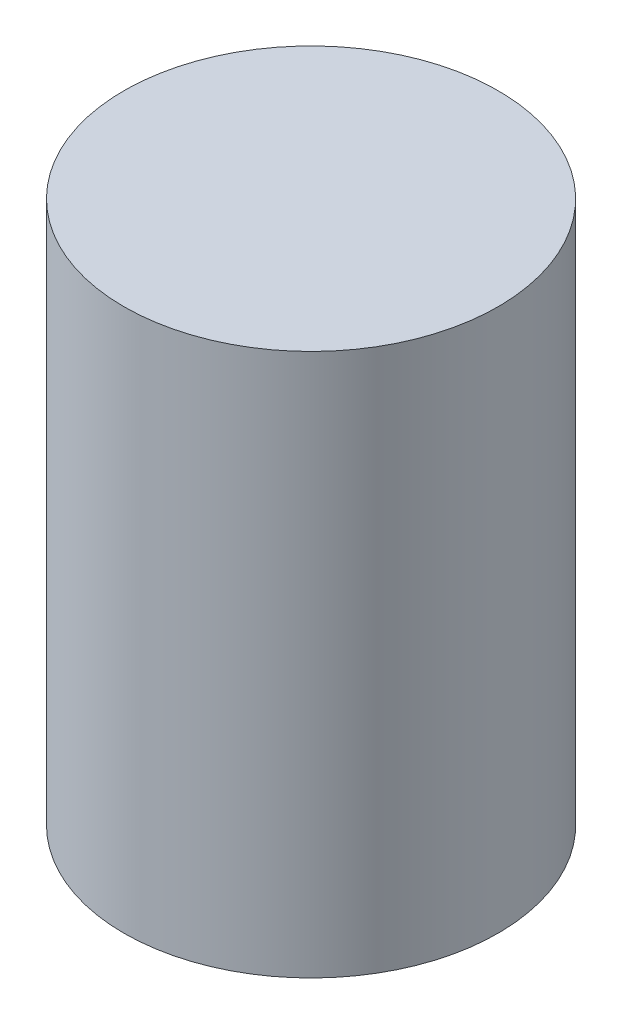
ISO-10303-21;
HEADER;
FILE_DESCRIPTION(('STEP AP214'),'2;1');
FILE_NAME('part.step','',(''),(''),'','','');
FILE_SCHEMA(('AUTOMOTIVE_DESIGN { 1 0 10303 214 1 1 1 1 }'));
ENDSEC;
DATA;
#1=APPLICATION_CONTEXT('core data for automotive mechanical design processes');
#2=APPLICATION_PROTOCOL_DEFINITION('international standard','automotive_design',2000,#1);
#3=PRODUCT_CONTEXT('',#1,'mechanical');
#4=PRODUCT('Part','Part','',(#3));
#5=PRODUCT_RELATED_PRODUCT_CATEGORY('part','',(#4));
#6=PRODUCT_DEFINITION_FORMATION('','',#4);
#7=PRODUCT_DEFINITION_CONTEXT('part definition',#1,'design');
#8=PRODUCT_DEFINITION('design','',#6,#7);
#9=PRODUCT_DEFINITION_SHAPE('','',#8);
#10=(LENGTH_UNIT() NAMED_UNIT(*) SI_UNIT(.MILLI.,.METRE.));
#11=(NAMED_UNIT(*) PLANE_ANGLE_UNIT() SI_UNIT($,.RADIAN.));
#12=(NAMED_UNIT(*) SI_UNIT($,.STERADIAN.) SOLID_ANGLE_UNIT());
#13=UNCERTAINTY_MEASURE_WITH_UNIT(LENGTH_MEASURE(1.E-05),#10,'distance_accuracy_value','');
#14=(GEOMETRIC_REPRESENTATION_CONTEXT(3) GLOBAL_UNCERTAINTY_ASSIGNED_CONTEXT((#13)) GLOBAL_UNIT_ASSIGNED_CONTEXT((#10,
#11,#12)) REPRESENTATION_CONTEXT('',''));
#15=CARTESIAN_POINT('',(0.,0.,0.));
#16=DIRECTION('',(0.,0.,1.));
#17=DIRECTION('',(1.,0.,0.));
#18=AXIS2_PLACEMENT_3D('',#15,#16,#17);
#19=CARTESIAN_POINT('',(0.,2.9,0.));
#20=DIRECTION('',(0.,-1.,0.));
#21=DIRECTION('',(0.,0.,-1.));
#22=AXIS2_PLACEMENT_3D('',#19,#20,#21);
#23=CYLINDRICAL_SURFACE('',#22,1.);
#24=CARTESIAN_POINT('',(0.,2.9,0.));
#25=DIRECTION('',(0.,1.,0.));
#26=DIRECTION('',(0.,0.,1.));
#27=AXIS2_PLACEMENT_3D('',#24,#25,#26);
#28=CIRCLE('',#27,1.);
#29=CARTESIAN_POINT('',(0.,2.9,1.));
#30=VERTEX_POINT('',#29);
#31=EDGE_CURVE('E10',#30,#30,#28,.T.);
#32=ORIENTED_EDGE('',*,*,#31,.F.);
#33=EDGE_LOOP('',(#32));
#34=FACE_BOUND('',#33,.T.);
#35=CARTESIAN_POINT('',(0.,0.,0.));
#36=DIRECTION('',(0.,1.,0.));
#37=DIRECTION('',(0.,0.,1.));
#38=AXIS2_PLACEMENT_3D('',#35,#36,#37);
#39=CIRCLE('',#38,1.);
#40=CARTESIAN_POINT('',(0.,0.,1.));
#41=VERTEX_POINT('',#40);
#42=EDGE_CURVE('E40',#41,#41,#39,.T.);
#43=ORIENTED_EDGE('',*,*,#42,.T.);
#44=EDGE_LOOP('',(#43));
#45=FACE_BOUND('',#44,.T.);
#46=ADVANCED_FACE('F37',(#34,#45),#23,.T.);
#47=CARTESIAN_POINT('',(0.,2.9,0.));
#48=DIRECTION('',(0.,1.,0.));
#49=DIRECTION('',(0.,0.,1.));
#50=AXIS2_PLACEMENT_3D('',#47,#48,#49);
#51=PLANE('',#50);
#52=ORIENTED_EDGE('',*,*,#31,.T.);
#53=EDGE_LOOP('',(#52));
#54=FACE_BOUND('',#53,.T.);
#55=ADVANCED_FACE('F54',(#54),#51,.T.);
#56=CARTESIAN_POINT('',(0.,0.,0.));
#57=DIRECTION('',(0.,1.,0.));
#58=DIRECTION('',(0.,0.,1.));
#59=AXIS2_PLACEMENT_3D('',#56,#57,#58);
#60=PLANE('',#59);
#61=ORIENTED_EDGE('',*,*,#42,.F.);
#62=EDGE_LOOP('',(#61));
#63=FACE_BOUND('',#62,.T.);
#64=ADVANCED_FACE('F52',(#63),#60,.F.);
#65=CLOSED_SHELL('',(#46,#55,#64));
#66=MANIFOLD_SOLID_BREP('B2',#65);
#67=ADVANCED_BREP_SHAPE_REPRESENTATION('',(#18,#66),#14);
#68=SHAPE_DEFINITION_REPRESENTATION(#9,#67);
ENDSEC;
END-ISO-10303-21;
